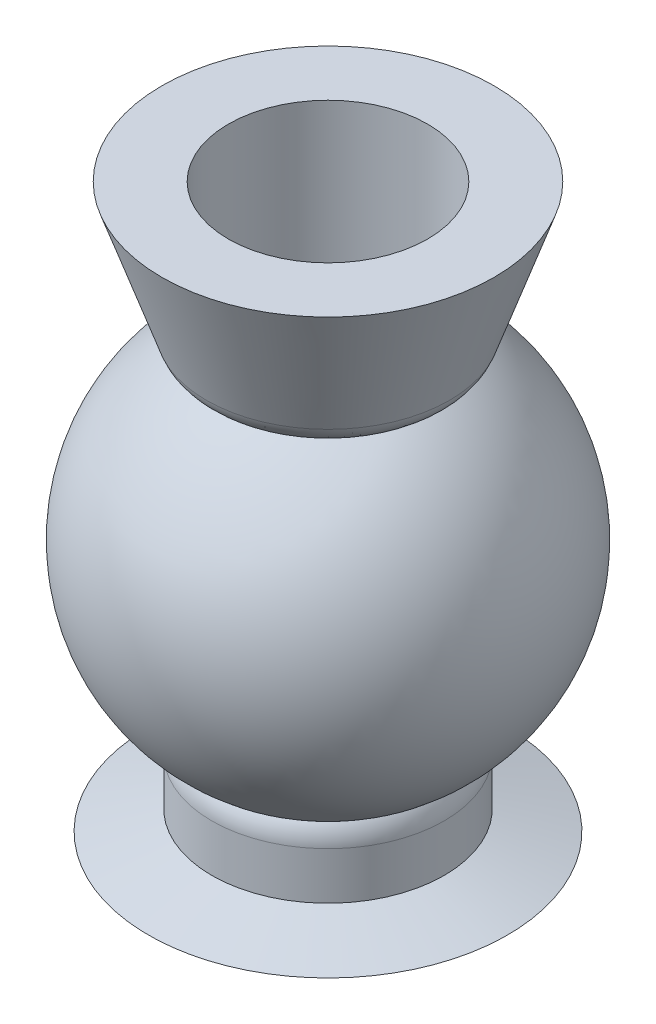
ISO-10303-21;
HEADER;
FILE_DESCRIPTION(('STEP AP214'),'2;1');
FILE_NAME('part.step','',(''),(''),'','','');
FILE_SCHEMA(('AUTOMOTIVE_DESIGN { 1 0 10303 214 1 1 1 1 }'));
ENDSEC;
DATA;
#1=APPLICATION_CONTEXT('core data for automotive mechanical design processes');
#2=APPLICATION_PROTOCOL_DEFINITION('international standard','automotive_design',2000,#1);
#3=PRODUCT_CONTEXT('',#1,'mechanical');
#4=PRODUCT('Part','Part','',(#3));
#5=PRODUCT_RELATED_PRODUCT_CATEGORY('part','',(#4));
#6=PRODUCT_DEFINITION_FORMATION('','',#4);
#7=PRODUCT_DEFINITION_CONTEXT('part definition',#1,'design');
#8=PRODUCT_DEFINITION('design','',#6,#7);
#9=PRODUCT_DEFINITION_SHAPE('','',#8);
#10=(LENGTH_UNIT() NAMED_UNIT(*) SI_UNIT(.MILLI.,.METRE.));
#11=(NAMED_UNIT(*) PLANE_ANGLE_UNIT() SI_UNIT($,.RADIAN.));
#12=(NAMED_UNIT(*) SI_UNIT($,.STERADIAN.) SOLID_ANGLE_UNIT());
#13=UNCERTAINTY_MEASURE_WITH_UNIT(LENGTH_MEASURE(1.E-05),#10,'distance_accuracy_value','');
#14=(GEOMETRIC_REPRESENTATION_CONTEXT(3) GLOBAL_UNCERTAINTY_ASSIGNED_CONTEXT((#13)) GLOBAL_UNIT_ASSIGNED_CONTEXT((#10,
#11,#12)) REPRESENTATION_CONTEXT('',''));
#15=CARTESIAN_POINT('',(0.,0.,0.));
#16=DIRECTION('',(0.,0.,1.));
#17=DIRECTION('',(1.,0.,0.));
#18=AXIS2_PLACEMENT_3D('',#15,#16,#17);
#19=CARTESIAN_POINT('',(2.5,4.67428149051589,0.));
#20=DIRECTION('',(0.,1.,0.));
#21=DIRECTION('',(0.,0.,1.));
#22=AXIS2_PLACEMENT_3D('',#19,#20,#21);
#23=PLANE('',#22);
#24=CARTESIAN_POINT('',(0.,4.67428149051589,0.));
#25=DIRECTION('',(0.,1.,0.));
#26=DIRECTION('',(0.,0.,1.));
#27=AXIS2_PLACEMENT_3D('',#24,#25,#26);
#28=CIRCLE('',#27,1.5);
#29=CARTESIAN_POINT('',(0.,4.67428149051589,1.5));
#30=VERTEX_POINT('',#29);
#31=EDGE_CURVE('E63',#30,#30,#28,.T.);
#32=ORIENTED_EDGE('',*,*,#31,.F.);
#33=EDGE_LOOP('',(#32));
#34=FACE_BOUND('',#33,.T.);
#35=CARTESIAN_POINT('',(0.,4.67428149051589,0.));
#36=DIRECTION('',(0.,-1.,0.));
#37=DIRECTION('',(0.,0.,-1.));
#38=AXIS2_PLACEMENT_3D('',#35,#36,#37);
#39=CIRCLE('',#38,2.5);
#40=CARTESIAN_POINT('',(0.,4.67428149051589,-2.5));
#41=VERTEX_POINT('',#40);
#42=EDGE_CURVE('E48',#41,#41,#39,.T.);
#43=ORIENTED_EDGE('',*,*,#42,.F.);
#44=EDGE_LOOP('',(#43));
#45=FACE_BOUND('',#44,.T.);
#46=ADVANCED_FACE('F33',(#34,#45),#23,.T.);
#47=CARTESIAN_POINT('',(0.,2.5,0.));
#48=DIRECTION('',(0.,1.,0.));
#49=DIRECTION('',(0.,0.,1.));
#50=AXIS2_PLACEMENT_3D('',#47,#48,#49);
#51=CONICAL_SURFACE('',#50,1.75,0.33216130554206);
#52=CARTESIAN_POINT('',(0.,2.73771652330893,0.));
#53=DIRECTION('',(0.,1.,0.));
#54=DIRECTION('',(0.,0.,1.));
#55=AXIS2_PLACEMENT_3D('',#52,#53,#54);
#56=CIRCLE('',#55,1.83199830300694);
#57=CARTESIAN_POINT('',(0.,2.73771652330893,1.83199830300694));
#58=VERTEX_POINT('',#57);
#59=EDGE_CURVE('E10',#58,#58,#56,.T.);
#60=ORIENTED_EDGE('',*,*,#59,.T.);
#61=EDGE_LOOP('',(#60));
#62=FACE_BOUND('',#61,.T.);
#63=ORIENTED_EDGE('',*,*,#42,.T.);
#64=EDGE_LOOP('',(#63));
#65=FACE_BOUND('',#64,.T.);
#66=ADVANCED_FACE('F81',(#62,#65),#51,.T.);
#67=CARTESIAN_POINT('',(0.,0.,0.));
#68=DIRECTION('',(0.,1.,0.));
#69=DIRECTION('',(1.,0.,0.));
#70=AXIS2_PLACEMENT_3D('',#67,#68,#69);
#71=SPHERICAL_SURFACE('',#70,3.);
#72=CARTESIAN_POINT('',(0.,-2.5,0.));
#73=DIRECTION('',(0.,1.,0.));
#74=DIRECTION('',(0.,0.,1.));
#75=AXIS2_PLACEMENT_3D('',#72,#73,#74);
#76=CIRCLE('',#75,1.6583123951777);
#77=CARTESIAN_POINT('',(1.6583123951777,-2.5,0.));
#78=VERTEX_POINT('',#77);
#79=EDGE_CURVE('E51',#78,#78,#76,.T.);
#80=CARTESIAN_POINT('',(0.,2.5,0.));
#81=DIRECTION('',(0.,-1.,0.));
#82=DIRECTION('',(0.,0.,-1.));
#83=AXIS2_PLACEMENT_3D('',#80,#81,#82);
#84=CIRCLE('',#83,1.6583123951777);
#85=CARTESIAN_POINT('',(1.6583123951777,2.5,0.));
#86=VERTEX_POINT('',#85);
#87=EDGE_CURVE('E44',#86,#86,#84,.T.);
#88=CARTESIAN_POINT('',(1.6583123951777,-2.5,0.));
#89=CARTESIAN_POINT('',(1.70962180028156,-2.46596828147414,0.));
#90=CARTESIAN_POINT('',(1.75988045936262,-2.43035300119367,0.));
#91=CARTESIAN_POINT('',(1.85811265511901,-2.35609932005257,0.));
#92=CARTESIAN_POINT('',(1.90608619179434,-2.31746091919195,0.));
#93=CARTESIAN_POINT('',(1.99956451237914,-2.23730499981961,0.));
#94=CARTESIAN_POINT('',(2.04506929628861,-2.1957874813079,0.));
#95=CARTESIAN_POINT('',(2.13343815691618,-2.11003130999208,0.));
#96=CARTESIAN_POINT('',(2.17630223363427,-2.06579265718798,0.));
#97=CARTESIAN_POINT('',(2.25922711093067,-1.97476169011429,0.));
#98=CARTESIAN_POINT('',(2.29928791150898,-1.92796937584471,0.));
#99=CARTESIAN_POINT('',(2.37645445745731,-1.83200845641089,0.));
#100=CARTESIAN_POINT('',(2.41356020282733,-1.78283985124665,0.));
#101=CARTESIAN_POINT('',(2.48467601311902,-1.68231266672303,0.));
#102=CARTESIAN_POINT('',(2.51868607804068,-1.63095408736365,0.));
#103=CARTESIAN_POINT('',(2.58348164553662,-1.52624158609184,0.));
#104=CARTESIAN_POINT('',(2.6142671481109,-1.47288766417941,0.));
#105=CARTESIAN_POINT('',(2.67249692559867,-1.36438666674699,0.));
#106=CARTESIAN_POINT('',(2.69994120051215,-1.309239591227,0.));
#107=CARTESIAN_POINT('',(2.75138452012869,-1.19736127198987,0.));
#108=CARTESIAN_POINT('',(2.77538356483174,-1.14063002827274,0.));
#109=CARTESIAN_POINT('',(2.81984547728037,-1.02579836110577,0.));
#110=CARTESIAN_POINT('',(2.84030834502596,-0.967697937655919,0.));
#111=CARTESIAN_POINT('',(2.87762035755849,-0.850348088208378,0.));
#112=CARTESIAN_POINT('',(2.89446950234544,-0.791098662210683,0.));
#113=CARTESIAN_POINT('',(2.92449021749528,-0.671675339086611,0.));
#114=CARTESIAN_POINT('',(2.93766178785817,-0.611501441960235,0.));
#115=CARTESIAN_POINT('',(2.96027743922245,-0.490457211376478,0.));
#116=CARTESIAN_POINT('',(2.96972152022385,-0.429586877919097,0.));
#117=CARTESIAN_POINT('',(2.98484640360758,-0.307380448682199,0.));
#118=CARTESIAN_POINT('',(2.9905272059899,-0.246044352902681,0.));
#119=CARTESIAN_POINT('',(2.99810400418612,-0.123138838082109,0.));
#120=CARTESIAN_POINT('',(3.,-0.0615694190410548,0.));
#121=CARTESIAN_POINT('',(3.,0.0615694190410542,0.));
#122=CARTESIAN_POINT('',(2.99810400418612,0.123138838082109,0.));
#123=CARTESIAN_POINT('',(2.9905272059899,0.246044352902681,0.));
#124=CARTESIAN_POINT('',(2.98484640360758,0.307380448682199,0.));
#125=CARTESIAN_POINT('',(2.96972152022385,0.429586877919097,0.));
#126=CARTESIAN_POINT('',(2.96027743922245,0.490457211376477,0.));
#127=CARTESIAN_POINT('',(2.93766178785817,0.611501441960234,0.));
#128=CARTESIAN_POINT('',(2.92449021749528,0.67167533908661,0.));
#129=CARTESIAN_POINT('',(2.89446950234544,0.791098662210682,0.));
#130=CARTESIAN_POINT('',(2.87762035755849,0.850348088208377,0.));
#131=CARTESIAN_POINT('',(2.84030834502596,0.967697937655919,0.));
#132=CARTESIAN_POINT('',(2.81984547728037,1.02579836110577,0.));
#133=CARTESIAN_POINT('',(2.77538356483174,1.14063002827274,0.));
#134=CARTESIAN_POINT('',(2.75138452012869,1.19736127198987,0.));
#135=CARTESIAN_POINT('',(2.69994120051216,1.309239591227,0.));
#136=CARTESIAN_POINT('',(2.67249692559867,1.36438666674699,0.));
#137=CARTESIAN_POINT('',(2.6142671481109,1.47288766417941,0.));
#138=CARTESIAN_POINT('',(2.58348164553662,1.52624158609184,0.));
#139=CARTESIAN_POINT('',(2.51868607804068,1.63095408736365,0.));
#140=CARTESIAN_POINT('',(2.48467601311902,1.68231266672303,0.));
#141=CARTESIAN_POINT('',(2.41356020282733,1.78283985124665,0.));
#142=CARTESIAN_POINT('',(2.37645445745731,1.83200845641089,0.));
#143=CARTESIAN_POINT('',(2.29928791150898,1.92796937584471,0.));
#144=CARTESIAN_POINT('',(2.25922711093067,1.97476169011429,0.));
#145=CARTESIAN_POINT('',(2.17630223363427,2.06579265718798,0.));
#146=CARTESIAN_POINT('',(2.13343815691618,2.11003130999208,0.));
#147=CARTESIAN_POINT('',(2.04506929628861,2.1957874813079,0.));
#148=CARTESIAN_POINT('',(1.99956451237914,2.23730499981961,0.));
#149=CARTESIAN_POINT('',(1.90608619179434,2.31746091919195,0.));
#150=CARTESIAN_POINT('',(1.85811265511901,2.35609932005257,0.));
#151=CARTESIAN_POINT('',(1.75988045936262,2.43035300119367,0.));
#152=CARTESIAN_POINT('',(1.70962180028156,2.46596828147414,0.));
#153=CARTESIAN_POINT('',(1.6583123951777,2.5,0.));
#154=B_SPLINE_CURVE_WITH_KNOTS('',3,(#88,#89,#90,#91,#92,#93,#94,#95,#96,#97,#98,#99,#100,#101,
#102,#103,#104,#105,#106,#107,#108,#109,#110,#111,#112,#113,#114,#115,#116,#117,#118,#119,#120,
#121,#122,#123,#124,#125,#126,#127,#128,#129,#130,#131,#132,#133,#134,#135,#136,#137,#138,#139,
#140,#141,#142,#143,#144,#145,#146,#147,#148,#149,#150,#151,#152,#153),.UNSPECIFIED.,.F.,.F.,(4,
2,2,2,2,2,2,2,2,2,2,2,2,2,2,2,2,2,2,2,2,2,2,2,2,2,2,2,2,2,2,2,4),(0.,0.184679098633125,
0.36935819726625,0.554037295899375,0.7387163945325,0.923395493165625,1.10807459179875,
1.29275369043187,1.477432789065,1.66211188769812,1.84679098633125,2.03147008496437,
2.2161491835975,2.40082828223062,2.58550738086375,2.77018647949687,2.95486557813,
3.13954467676312,3.32422377539625,3.50890287402937,3.6935819726625,3.87826107129562,
4.06294016992875,4.24761926856187,4.432298367195,4.61697746582812,4.80165656446125,
4.98633566309437,5.1710147617275,5.35569386036062,5.54037295899375,5.72505205762687,
5.90973115626),.UNSPECIFIED.);
#155=EDGE_CURVE('BSEAM86',#78,#86,#154,.T.);
#156=ORIENTED_EDGE('',*,*,#79,.T.);
#157=ORIENTED_EDGE('',*,*,#87,.T.);
#158=ORIENTED_EDGE('',*,*,#155,.T.);
#159=ORIENTED_EDGE('',*,*,#155,.F.);
#160=EDGE_LOOP('',(#156,#158,#157,#159));
#161=FACE_BOUND('',#160,.T.);
#162=ADVANCED_FACE('F86',(#161),#71,.T.);
#163=CARTESIAN_POINT('',(0.,-4.24121025335359,0.));
#164=DIRECTION('',(0.,-1.,0.));
#165=DIRECTION('',(0.,0.,-1.));
#166=AXIS2_PLACEMENT_3D('',#163,#164,#165);
#167=CYLINDRICAL_SURFACE('',#166,1.75);
#168=CARTESIAN_POINT('',(0.,-2.78858445547924,0.));
#169=DIRECTION('',(0.,1.,0.));
#170=DIRECTION('',(0.,0.,1.));
#171=AXIS2_PLACEMENT_3D('',#168,#169,#170);
#172=CIRCLE('',#171,1.75);
#173=CARTESIAN_POINT('',(0.,-2.78858445547924,1.75));
#174=VERTEX_POINT('',#173);
#175=EDGE_CURVE('E40',#174,#174,#172,.F.);
#176=ORIENTED_EDGE('',*,*,#175,.T.);
#177=EDGE_LOOP('',(#176));
#178=FACE_BOUND('',#177,.T.);
#179=CARTESIAN_POINT('',(0.,-3.5,0.));
#180=DIRECTION('',(0.,-1.,0.));
#181=DIRECTION('',(0.,0.,-1.));
#182=AXIS2_PLACEMENT_3D('',#179,#180,#181);
#183=CIRCLE('',#182,1.75);
#184=CARTESIAN_POINT('',(0.,-3.5,-1.75));
#185=VERTEX_POINT('',#184);
#186=EDGE_CURVE('E53',#185,#185,#183,.T.);
#187=ORIENTED_EDGE('',*,*,#186,.F.);
#188=EDGE_LOOP('',(#187));
#189=FACE_BOUND('',#188,.T.);
#190=ADVANCED_FACE('F91',(#178,#189),#167,.T.);
#191=CARTESIAN_POINT('',(0.,-3.8,0.));
#192=DIRECTION('',(0.,-1.,0.));
#193=DIRECTION('',(0.,0.,-1.));
#194=AXIS2_PLACEMENT_3D('',#191,#192,#193);
#195=CONICAL_SURFACE('',#194,2.70393920141695,1.2661036727795);
#196=ORIENTED_EDGE('',*,*,#186,.T.);
#197=EDGE_LOOP('',(#196));
#198=FACE_BOUND('',#197,.T.);
#199=CARTESIAN_POINT('',(0.,-3.8,0.));
#200=DIRECTION('',(0.,-1.,0.));
#201=DIRECTION('',(0.,0.,-1.));
#202=AXIS2_PLACEMENT_3D('',#199,#200,#201);
#203=CIRCLE('',#202,2.70393920141695);
#204=CARTESIAN_POINT('',(0.,-3.8,-2.70393920141695));
#205=VERTEX_POINT('',#204);
#206=EDGE_CURVE('E59',#205,#205,#203,.T.);
#207=ORIENTED_EDGE('',*,*,#206,.F.);
#208=EDGE_LOOP('',(#207));
#209=FACE_BOUND('',#208,.T.);
#210=ADVANCED_FACE('F122',(#198,#209),#195,.T.);
#211=CARTESIAN_POINT('',(2.70393920141695,-3.8,0.));
#212=DIRECTION('',(0.,-1.,0.));
#213=DIRECTION('',(0.,0.,-1.));
#214=AXIS2_PLACEMENT_3D('',#211,#212,#213);
#215=PLANE('',#214);
#216=CARTESIAN_POINT('',(0.,-3.8,0.));
#217=DIRECTION('',(0.,1.,0.));
#218=DIRECTION('',(0.,0.,1.));
#219=AXIS2_PLACEMENT_3D('',#216,#217,#218);
#220=CIRCLE('',#219,1.5);
#221=CARTESIAN_POINT('',(0.,-3.8,1.5));
#222=VERTEX_POINT('',#221);
#223=EDGE_CURVE('E62',#222,#222,#220,.T.);
#224=ORIENTED_EDGE('',*,*,#223,.T.);
#225=EDGE_LOOP('',(#224));
#226=FACE_BOUND('',#225,.T.);
#227=ORIENTED_EDGE('',*,*,#206,.T.);
#228=EDGE_LOOP('',(#227));
#229=FACE_BOUND('',#228,.T.);
#230=ADVANCED_FACE('F69',(#226,#229),#215,.T.);
#231=CARTESIAN_POINT('',(0.,-3.8,0.));
#232=DIRECTION('',(0.,1.,0.));
#233=DIRECTION('',(0.,0.,1.));
#234=AXIS2_PLACEMENT_3D('',#231,#232,#233);
#235=CYLINDRICAL_SURFACE('',#234,1.5);
#236=ORIENTED_EDGE('',*,*,#223,.F.);
#237=EDGE_LOOP('',(#236));
#238=FACE_BOUND('',#237,.T.);
#239=ORIENTED_EDGE('',*,*,#31,.T.);
#240=EDGE_LOOP('',(#239));
#241=FACE_BOUND('',#240,.T.);
#242=ADVANCED_FACE('F72',(#238,#241),#235,.F.);
#243=CARTESIAN_POINT('',(0.,-2.78858445547924,0.));
#244=DIRECTION('',(0.,1.,0.));
#245=DIRECTION('',(0.,0.,1.));
#246=AXIS2_PLACEMENT_3D('',#243,#244,#245);
#247=TOROIDAL_SURFACE('',#246,1.25,0.5);
#248=ORIENTED_EDGE('',*,*,#79,.F.);
#249=EDGE_LOOP('',(#248));
#250=FACE_BOUND('',#249,.T.);
#251=ORIENTED_EDGE('',*,*,#175,.F.);
#252=EDGE_LOOP('',(#251));
#253=FACE_BOUND('',#252,.T.);
#254=ADVANCED_FACE('F75',(#250,#253),#247,.T.);
#255=CARTESIAN_POINT('',(0.,2.9007600015698,0.));
#256=DIRECTION('',(0.,-1.,0.));
#257=DIRECTION('',(0.,0.,-1.));
#258=AXIS2_PLACEMENT_3D('',#255,#256,#257);
#259=TOROIDAL_SURFACE('',#258,1.35932841376435,0.5);
#260=ORIENTED_EDGE('',*,*,#59,.F.);
#261=EDGE_LOOP('',(#260));
#262=FACE_BOUND('',#261,.T.);
#263=ORIENTED_EDGE('',*,*,#87,.F.);
#264=EDGE_LOOP('',(#263));
#265=FACE_BOUND('',#264,.T.);
#266=ADVANCED_FACE('F35',(#262,#265),#259,.T.);
#267=CLOSED_SHELL('',(#46,#66,#162,#190,#210,#230,#242,#254,#266));
#268=MANIFOLD_SOLID_BREP('B2',#267);
#269=ADVANCED_BREP_SHAPE_REPRESENTATION('',(#18,#268),#14);
#270=SHAPE_DEFINITION_REPRESENTATION(#9,#269);
ENDSEC;
END-ISO-10303-21;
